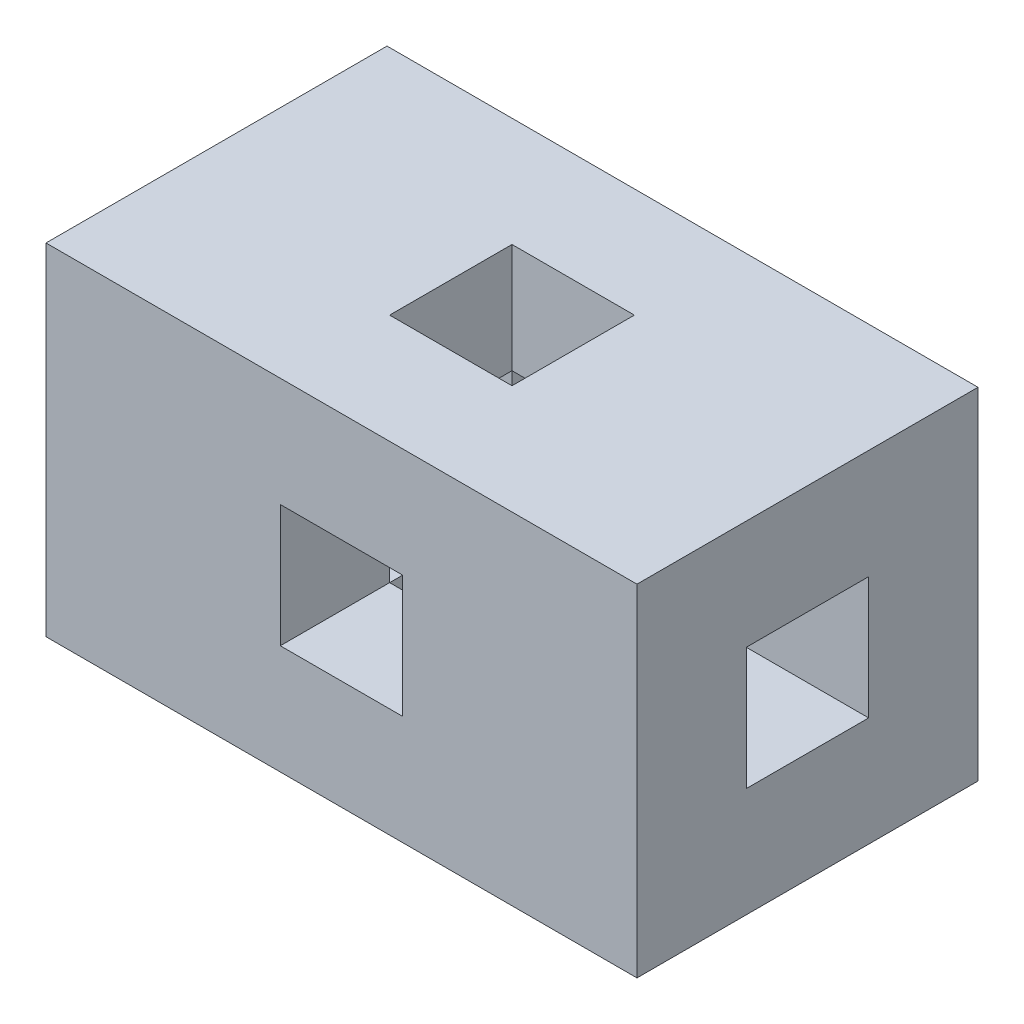
ISO-10303-21;
HEADER;
FILE_DESCRIPTION(('STEP AP214'),'2;1');
FILE_NAME('part.step','',(''),(''),'','','');
FILE_SCHEMA(('AUTOMOTIVE_DESIGN { 1 0 10303 214 1 1 1 1 }'));
ENDSEC;
DATA;
#1=APPLICATION_CONTEXT('core data for automotive mechanical design processes');
#2=APPLICATION_PROTOCOL_DEFINITION('international standard','automotive_design',2000,#1);
#3=PRODUCT_CONTEXT('',#1,'mechanical');
#4=PRODUCT('Part','Part','',(#3));
#5=PRODUCT_RELATED_PRODUCT_CATEGORY('part','',(#4));
#6=PRODUCT_DEFINITION_FORMATION('','',#4);
#7=PRODUCT_DEFINITION_CONTEXT('part definition',#1,'design');
#8=PRODUCT_DEFINITION('design','',#6,#7);
#9=PRODUCT_DEFINITION_SHAPE('','',#8);
#10=(LENGTH_UNIT() NAMED_UNIT(*) SI_UNIT(.MILLI.,.METRE.));
#11=(NAMED_UNIT(*) PLANE_ANGLE_UNIT() SI_UNIT($,.RADIAN.));
#12=(NAMED_UNIT(*) SI_UNIT($,.STERADIAN.) SOLID_ANGLE_UNIT());
#13=UNCERTAINTY_MEASURE_WITH_UNIT(LENGTH_MEASURE(1.E-05),#10,'distance_accuracy_value','');
#14=(GEOMETRIC_REPRESENTATION_CONTEXT(3) GLOBAL_UNCERTAINTY_ASSIGNED_CONTEXT((#13)) GLOBAL_UNIT_ASSIGNED_CONTEXT((#10,
#11,#12)) REPRESENTATION_CONTEXT('',''));
#15=CARTESIAN_POINT('',(0.,0.,0.));
#16=DIRECTION('',(0.,0.,1.));
#17=DIRECTION('',(1.,0.,0.));
#18=AXIS2_PLACEMENT_3D('',#15,#16,#17);
#19=CARTESIAN_POINT('',(7.747,-21.59,-7.747));
#20=DIRECTION('',(1.,0.,0.));
#21=DIRECTION('',(0.,0.,-1.));
#22=AXIS2_PLACEMENT_3D('',#19,#20,#21);
#23=PLANE('',#22);
#24=DIRECTION('',(0.,0.,1.));
#25=VECTOR('',#24,1.);
#26=CARTESIAN_POINT('',(7.747,-7.747,-21.59));
#27=LINE('',#26,#25);
#28=CARTESIAN_POINT('',(7.747,-7.747,-21.59));
#29=VERTEX_POINT('',#28);
#30=CARTESIAN_POINT('',(7.747,-7.747,-7.747));
#31=VERTEX_POINT('',#30);
#32=EDGE_CURVE('E262',#29,#31,#27,.T.);
#33=ORIENTED_EDGE('',*,*,#32,.T.);
#34=DIRECTION('',(0.,1.,0.));
#35=VECTOR('',#34,1.);
#36=CARTESIAN_POINT('',(7.747,-21.59,-7.74700000000001));
#37=LINE('',#36,#35);
#38=CARTESIAN_POINT('',(7.747,7.747,-7.747));
#39=VERTEX_POINT('',#38);
#40=EDGE_CURVE('E227',#31,#39,#37,.T.);
#41=ORIENTED_EDGE('',*,*,#40,.T.);
#42=DIRECTION('',(0.,0.,1.));
#43=VECTOR('',#42,1.);
#44=CARTESIAN_POINT('',(7.747,7.747,-21.59));
#45=LINE('',#44,#43);
#46=CARTESIAN_POINT('',(7.747,7.747,-21.59));
#47=VERTEX_POINT('',#46);
#48=EDGE_CURVE('E275',#47,#39,#45,.T.);
#49=ORIENTED_EDGE('',*,*,#48,.F.);
#50=DIRECTION('',(0.,1.,0.));
#51=VECTOR('',#50,1.);
#52=CARTESIAN_POINT('',(7.747,7.747,-21.59));
#53=LINE('',#52,#51);
#54=EDGE_CURVE('E239',#29,#47,#53,.T.);
#55=ORIENTED_EDGE('',*,*,#54,.F.);
#56=EDGE_LOOP('',(#33,#41,#49,#55));
#57=FACE_BOUND('',#56,.T.);
#58=ADVANCED_FACE('F35',(#57),#23,.F.);
#59=DIRECTION('',(0.,1.,0.));
#60=VECTOR('',#59,1.);
#61=CARTESIAN_POINT('',(7.747,-21.59,7.747));
#62=LINE('',#61,#60);
#63=CARTESIAN_POINT('',(7.747,-21.59,7.747));
#64=VERTEX_POINT('',#63);
#65=CARTESIAN_POINT('',(7.747,-7.747,7.747));
#66=VERTEX_POINT('',#65);
#67=EDGE_CURVE('E308',#64,#66,#62,.T.);
#68=ORIENTED_EDGE('',*,*,#67,.T.);
#69=DIRECTION('',(0.,0.,-1.));
#70=VECTOR('',#69,1.);
#71=CARTESIAN_POINT('',(7.747,-7.747,-7.747));
#72=LINE('',#71,#70);
#73=EDGE_CURVE('E235',#66,#31,#72,.T.);
#74=ORIENTED_EDGE('',*,*,#73,.T.);
#75=DIRECTION('',(0.,1.,0.));
#76=VECTOR('',#75,1.);
#77=CARTESIAN_POINT('',(7.747,-21.59,-7.747));
#78=LINE('',#77,#76);
#79=CARTESIAN_POINT('',(7.747,-21.59,-7.747));
#80=VERTEX_POINT('',#79);
#81=EDGE_CURVE('E321',#80,#31,#78,.T.);
#82=ORIENTED_EDGE('',*,*,#81,.F.);
#83=DIRECTION('',(0.,0.,-1.));
#84=VECTOR('',#83,1.);
#85=CARTESIAN_POINT('',(7.747,-21.59,-7.747));
#86=LINE('',#85,#84);
#87=EDGE_CURVE('E284',#64,#80,#86,.T.);
#88=ORIENTED_EDGE('',*,*,#87,.F.);
#89=EDGE_LOOP('',(#68,#74,#82,#88));
#90=FACE_BOUND('',#89,.T.);
#91=ADVANCED_FACE('F371',(#90),#23,.F.);
#92=CARTESIAN_POINT('',(7.747,7.747,7.747));
#93=VERTEX_POINT('',#92);
#94=CARTESIAN_POINT('',(7.747,7.747,21.59));
#95=VERTEX_POINT('',#94);
#96=EDGE_CURVE('E252',#93,#95,#45,.T.);
#97=ORIENTED_EDGE('',*,*,#96,.F.);
#98=DIRECTION('',(0.,-1.,0.));
#99=VECTOR('',#98,1.);
#100=CARTESIAN_POINT('',(7.747,-21.59,7.74699999999999));
#101=LINE('',#100,#99);
#102=EDGE_CURVE('E223',#93,#66,#101,.T.);
#103=ORIENTED_EDGE('',*,*,#102,.T.);
#104=CARTESIAN_POINT('',(7.747,-7.747,21.59));
#105=VERTEX_POINT('',#104);
#106=EDGE_CURVE('E266',#66,#105,#27,.T.);
#107=ORIENTED_EDGE('',*,*,#106,.T.);
#108=DIRECTION('',(0.,1.,0.));
#109=VECTOR('',#108,1.);
#110=CARTESIAN_POINT('',(7.747,7.747,21.59));
#111=LINE('',#110,#109);
#112=EDGE_CURVE('E238',#105,#95,#111,.T.);
#113=ORIENTED_EDGE('',*,*,#112,.T.);
#114=EDGE_LOOP('',(#97,#103,#107,#113));
#115=FACE_BOUND('',#114,.T.);
#116=ADVANCED_FACE('F384',(#115),#23,.F.);
#117=CARTESIAN_POINT('',(-7.747,-21.59,-7.747));
#118=DIRECTION('',(-1.,0.,0.));
#119=DIRECTION('',(0.,0.,1.));
#120=AXIS2_PLACEMENT_3D('',#117,#118,#119);
#121=PLANE('',#120);
#122=DIRECTION('',(0.,0.,1.));
#123=VECTOR('',#122,1.);
#124=CARTESIAN_POINT('',(-7.747,7.747,-21.59));
#125=LINE('',#124,#123);
#126=CARTESIAN_POINT('',(-7.747,7.747,-21.59));
#127=VERTEX_POINT('',#126);
#128=CARTESIAN_POINT('',(-7.747,7.747,-7.747));
#129=VERTEX_POINT('',#128);
#130=EDGE_CURVE('E271',#127,#129,#125,.T.);
#131=ORIENTED_EDGE('',*,*,#130,.T.);
#132=DIRECTION('',(0.,-1.,0.));
#133=VECTOR('',#132,1.);
#134=CARTESIAN_POINT('',(-7.747,-21.59,-7.74700000000001));
#135=LINE('',#134,#133);
#136=CARTESIAN_POINT('',(-7.747,-7.747,-7.747));
#137=VERTEX_POINT('',#136);
#138=EDGE_CURVE('E182',#129,#137,#135,.T.);
#139=ORIENTED_EDGE('',*,*,#138,.T.);
#140=DIRECTION('',(0.,0.,1.));
#141=VECTOR('',#140,1.);
#142=CARTESIAN_POINT('',(-7.747,-7.747,-21.59));
#143=LINE('',#142,#141);
#144=CARTESIAN_POINT('',(-7.747,-7.747,-21.59));
#145=VERTEX_POINT('',#144);
#146=EDGE_CURVE('E267',#145,#137,#143,.T.);
#147=ORIENTED_EDGE('',*,*,#146,.F.);
#148=DIRECTION('',(0.,-1.,0.));
#149=VECTOR('',#148,1.);
#150=CARTESIAN_POINT('',(-7.747,7.747,-21.59));
#151=LINE('',#150,#149);
#152=EDGE_CURVE('E246',#127,#145,#151,.T.);
#153=ORIENTED_EDGE('',*,*,#152,.F.);
#154=EDGE_LOOP('',(#131,#139,#147,#153));
#155=FACE_BOUND('',#154,.T.);
#156=ADVANCED_FACE('F427',(#155),#121,.F.);
#157=DIRECTION('',(0.,1.,0.));
#158=VECTOR('',#157,1.);
#159=CARTESIAN_POINT('',(-7.747,-21.59,-7.747));
#160=LINE('',#159,#158);
#161=CARTESIAN_POINT('',(-7.747,-21.59,-7.747));
#162=VERTEX_POINT('',#161);
#163=EDGE_CURVE('E317',#162,#137,#160,.T.);
#164=ORIENTED_EDGE('',*,*,#163,.T.);
#165=DIRECTION('',(0.,0.,1.));
#166=VECTOR('',#165,1.);
#167=CARTESIAN_POINT('',(-7.747,-7.747,-7.747));
#168=LINE('',#167,#166);
#169=CARTESIAN_POINT('',(-7.747,-7.747,7.747));
#170=VERTEX_POINT('',#169);
#171=EDGE_CURVE('E11',#137,#170,#168,.T.);
#172=ORIENTED_EDGE('',*,*,#171,.T.);
#173=DIRECTION('',(0.,1.,0.));
#174=VECTOR('',#173,1.);
#175=CARTESIAN_POINT('',(-7.747,-21.59,7.747));
#176=LINE('',#175,#174);
#177=CARTESIAN_POINT('',(-7.747,-21.59,7.747));
#178=VERTEX_POINT('',#177);
#179=EDGE_CURVE('E313',#178,#170,#176,.T.);
#180=ORIENTED_EDGE('',*,*,#179,.F.);
#181=DIRECTION('',(0.,0.,1.));
#182=VECTOR('',#181,1.);
#183=CARTESIAN_POINT('',(-7.747,-21.59,-7.747));
#184=LINE('',#183,#182);
#185=EDGE_CURVE('E291',#162,#178,#184,.T.);
#186=ORIENTED_EDGE('',*,*,#185,.F.);
#187=EDGE_LOOP('',(#164,#172,#180,#186));
#188=FACE_BOUND('',#187,.T.);
#189=ADVANCED_FACE('F363',(#188),#121,.F.);
#190=CARTESIAN_POINT('',(-7.747,-7.747,21.59));
#191=VERTEX_POINT('',#190);
#192=EDGE_CURVE('E270',#170,#191,#143,.T.);
#193=ORIENTED_EDGE('',*,*,#192,.F.);
#194=DIRECTION('',(0.,1.,0.));
#195=VECTOR('',#194,1.);
#196=CARTESIAN_POINT('',(-7.747,-21.59,7.74699999999999));
#197=LINE('',#196,#195);
#198=CARTESIAN_POINT('',(-7.747,7.747,7.747));
#199=VERTEX_POINT('',#198);
#200=EDGE_CURVE('E214',#170,#199,#197,.T.);
#201=ORIENTED_EDGE('',*,*,#200,.T.);
#202=CARTESIAN_POINT('',(-7.747,7.747,21.59));
#203=VERTEX_POINT('',#202);
#204=EDGE_CURVE('E274',#199,#203,#125,.T.);
#205=ORIENTED_EDGE('',*,*,#204,.T.);
#206=DIRECTION('',(0.,-1.,0.));
#207=VECTOR('',#206,1.);
#208=CARTESIAN_POINT('',(-7.747,7.747,21.59));
#209=LINE('',#208,#207);
#210=EDGE_CURVE('E257',#203,#191,#209,.T.);
#211=ORIENTED_EDGE('',*,*,#210,.T.);
#212=EDGE_LOOP('',(#193,#201,#205,#211));
#213=FACE_BOUND('',#212,.T.);
#214=ADVANCED_FACE('F395',(#213),#121,.F.);
#215=CARTESIAN_POINT('',(-7.747,-21.59,7.747));
#216=DIRECTION('',(0.,0.,1.));
#217=DIRECTION('',(1.,0.,0.));
#218=AXIS2_PLACEMENT_3D('',#215,#216,#217);
#219=PLANE('',#218);
#220=ORIENTED_EDGE('',*,*,#179,.T.);
#221=DIRECTION('',(1.,0.,0.));
#222=VECTOR('',#221,1.);
#223=CARTESIAN_POINT('',(-7.747,-7.747,7.747));
#224=LINE('',#223,#222);
#225=EDGE_CURVE('E280',#170,#66,#224,.T.);
#226=ORIENTED_EDGE('',*,*,#225,.T.);
#227=ORIENTED_EDGE('',*,*,#67,.F.);
#228=DIRECTION('',(1.,0.,0.));
#229=VECTOR('',#228,1.);
#230=CARTESIAN_POINT('',(-7.747,-21.59,7.747));
#231=LINE('',#230,#229);
#232=EDGE_CURVE('E294',#178,#64,#231,.T.);
#233=ORIENTED_EDGE('',*,*,#232,.F.);
#234=EDGE_LOOP('',(#220,#226,#227,#233));
#235=FACE_BOUND('',#234,.T.);
#236=ADVANCED_FACE('F393',(#235),#219,.F.);
#237=CARTESIAN_POINT('',(-7.747,-21.59,-7.747));
#238=DIRECTION('',(0.,0.,-1.));
#239=DIRECTION('',(-1.,0.,0.));
#240=AXIS2_PLACEMENT_3D('',#237,#238,#239);
#241=PLANE('',#240);
#242=ORIENTED_EDGE('',*,*,#81,.T.);
#243=DIRECTION('',(-1.,0.,0.));
#244=VECTOR('',#243,1.);
#245=CARTESIAN_POINT('',(-7.747,-7.747,-7.747));
#246=LINE('',#245,#244);
#247=EDGE_CURVE('E43',#31,#137,#246,.T.);
#248=ORIENTED_EDGE('',*,*,#247,.T.);
#249=ORIENTED_EDGE('',*,*,#163,.F.);
#250=DIRECTION('',(-1.,0.,0.));
#251=VECTOR('',#250,1.);
#252=CARTESIAN_POINT('',(-7.747,-21.59,-7.747));
#253=LINE('',#252,#251);
#254=EDGE_CURVE('E287',#80,#162,#253,.T.);
#255=ORIENTED_EDGE('',*,*,#254,.F.);
#256=EDGE_LOOP('',(#242,#248,#249,#255));
#257=FACE_BOUND('',#256,.T.);
#258=ADVANCED_FACE('F359',(#257),#241,.F.);
#259=CARTESIAN_POINT('',(37.4142,21.59,21.59));
#260=DIRECTION('',(-1.,0.,0.));
#261=DIRECTION('',(0.,0.,1.));
#262=AXIS2_PLACEMENT_3D('',#259,#260,#261);
#263=PLANE('',#262);
#264=DIRECTION('',(0.,0.,1.));
#265=VECTOR('',#264,1.);
#266=CARTESIAN_POINT('',(37.4142,7.747,7.747));
#267=LINE('',#266,#265);
#268=CARTESIAN_POINT('',(37.4142,7.747,-7.747));
#269=VERTEX_POINT('',#268);
#270=CARTESIAN_POINT('',(37.4142,7.747,7.747));
#271=VERTEX_POINT('',#270);
#272=EDGE_CURVE('E207',#269,#271,#267,.T.);
#273=ORIENTED_EDGE('',*,*,#272,.F.);
#274=DIRECTION('',(0.,1.,0.));
#275=VECTOR('',#274,1.);
#276=CARTESIAN_POINT('',(37.4142,7.747,-7.747));
#277=LINE('',#276,#275);
#278=CARTESIAN_POINT('',(37.4142,-7.747,-7.747));
#279=VERTEX_POINT('',#278);
#280=EDGE_CURVE('E50',#279,#269,#277,.T.);
#281=ORIENTED_EDGE('',*,*,#280,.F.);
#282=DIRECTION('',(0.,0.,-1.));
#283=VECTOR('',#282,1.);
#284=CARTESIAN_POINT('',(37.4142,-7.747,7.747));
#285=LINE('',#284,#283);
#286=CARTESIAN_POINT('',(37.4142,-7.747,7.747));
#287=VERTEX_POINT('',#286);
#288=EDGE_CURVE('E198',#287,#279,#285,.T.);
#289=ORIENTED_EDGE('',*,*,#288,.F.);
#290=DIRECTION('',(0.,-1.,0.));
#291=VECTOR('',#290,1.);
#292=CARTESIAN_POINT('',(37.4142,7.747,7.747));
#293=LINE('',#292,#291);
#294=EDGE_CURVE('E201',#271,#287,#293,.T.);
#295=ORIENTED_EDGE('',*,*,#294,.F.);
#296=EDGE_LOOP('',(#273,#281,#289,#295));
#297=FACE_BOUND('',#296,.T.);
#298=DIRECTION('',(0.,0.,-1.));
#299=VECTOR('',#298,1.);
#300=CARTESIAN_POINT('',(37.4142,-21.59,21.59));
#301=LINE('',#300,#299);
#302=CARTESIAN_POINT('',(37.4142,-21.59,21.59));
#303=VERTEX_POINT('',#302);
#304=CARTESIAN_POINT('',(37.4142,-21.59,-21.59));
#305=VERTEX_POINT('',#304);
#306=EDGE_CURVE('E311',#303,#305,#301,.T.);
#307=ORIENTED_EDGE('',*,*,#306,.T.);
#308=DIRECTION('',(0.,-1.,0.));
#309=VECTOR('',#308,1.);
#310=CARTESIAN_POINT('',(37.4142,21.59,-21.59));
#311=LINE('',#310,#309);
#312=CARTESIAN_POINT('',(37.4142,21.59,-21.59));
#313=VERTEX_POINT('',#312);
#314=EDGE_CURVE('E350',#313,#305,#311,.T.);
#315=ORIENTED_EDGE('',*,*,#314,.F.);
#316=DIRECTION('',(0.,0.,-1.));
#317=VECTOR('',#316,1.);
#318=CARTESIAN_POINT('',(37.4142,21.59,21.59));
#319=LINE('',#318,#317);
#320=CARTESIAN_POINT('',(37.4142,21.59,21.59));
#321=VERTEX_POINT('',#320);
#322=EDGE_CURVE('E324',#321,#313,#319,.T.);
#323=ORIENTED_EDGE('',*,*,#322,.F.);
#324=DIRECTION('',(0.,-1.,0.));
#325=VECTOR('',#324,1.);
#326=CARTESIAN_POINT('',(37.4142,21.59,21.59));
#327=LINE('',#326,#325);
#328=EDGE_CURVE('E334',#321,#303,#327,.T.);
#329=ORIENTED_EDGE('',*,*,#328,.T.);
#330=EDGE_LOOP('',(#307,#315,#323,#329));
#331=FACE_BOUND('',#330,.T.);
#332=ADVANCED_FACE('F37',(#297,#331),#263,.F.);
#333=CARTESIAN_POINT('',(37.4142,21.59,-21.59));
#334=DIRECTION('',(0.,0.,1.));
#335=DIRECTION('',(1.,0.,0.));
#336=AXIS2_PLACEMENT_3D('',#333,#334,#335);
#337=PLANE('',#336);
#338=DIRECTION('',(1.,0.,0.));
#339=VECTOR('',#338,1.);
#340=CARTESIAN_POINT('',(-7.747,-7.747,-21.59));
#341=LINE('',#340,#339);
#342=EDGE_CURVE('E249',#145,#29,#341,.T.);
#343=ORIENTED_EDGE('',*,*,#342,.T.);
#344=ORIENTED_EDGE('',*,*,#54,.T.);
#345=DIRECTION('',(-1.,0.,0.));
#346=VECTOR('',#345,1.);
#347=CARTESIAN_POINT('',(-7.747,7.747,-21.59));
#348=LINE('',#347,#346);
#349=EDGE_CURVE('E242',#47,#127,#348,.T.);
#350=ORIENTED_EDGE('',*,*,#349,.T.);
#351=ORIENTED_EDGE('',*,*,#152,.T.);
#352=EDGE_LOOP('',(#343,#344,#350,#351));
#353=FACE_BOUND('',#352,.T.);
#354=DIRECTION('',(-1.,0.,0.));
#355=VECTOR('',#354,1.);
#356=CARTESIAN_POINT('',(37.4142,-21.59,-21.59));
#357=LINE('',#356,#355);
#358=CARTESIAN_POINT('',(-37.4142,-21.59,-21.59));
#359=VERTEX_POINT('',#358);
#360=EDGE_CURVE('E337',#305,#359,#357,.T.);
#361=ORIENTED_EDGE('',*,*,#360,.T.);
#362=DIRECTION('',(0.,-1.,0.));
#363=VECTOR('',#362,1.);
#364=CARTESIAN_POINT('',(-37.4142,21.59,-21.59));
#365=LINE('',#364,#363);
#366=CARTESIAN_POINT('',(-37.4142,21.59,-21.59));
#367=VERTEX_POINT('',#366);
#368=EDGE_CURVE('E347',#367,#359,#365,.T.);
#369=ORIENTED_EDGE('',*,*,#368,.F.);
#370=DIRECTION('',(-1.,0.,0.));
#371=VECTOR('',#370,1.);
#372=CARTESIAN_POINT('',(37.4142,21.59,-21.59));
#373=LINE('',#372,#371);
#374=EDGE_CURVE('E327',#313,#367,#373,.T.);
#375=ORIENTED_EDGE('',*,*,#374,.F.);
#376=ORIENTED_EDGE('',*,*,#314,.T.);
#377=EDGE_LOOP('',(#361,#369,#375,#376));
#378=FACE_BOUND('',#377,.T.);
#379=ADVANCED_FACE('F462',(#353,#378),#337,.F.);
#380=CARTESIAN_POINT('',(-37.4142,21.59,21.59));
#381=DIRECTION('',(1.,0.,0.));
#382=DIRECTION('',(0.,0.,-1.));
#383=AXIS2_PLACEMENT_3D('',#380,#381,#382);
#384=PLANE('',#383);
#385=DIRECTION('',(0.,0.,-1.));
#386=VECTOR('',#385,1.);
#387=CARTESIAN_POINT('',(-37.4142,-7.747,7.747));
#388=LINE('',#387,#386);
#389=CARTESIAN_POINT('',(-37.4142,-7.747,7.747));
#390=VERTEX_POINT('',#389);
#391=CARTESIAN_POINT('',(-37.4142,-7.747,-7.747));
#392=VERTEX_POINT('',#391);
#393=EDGE_CURVE('E197',#390,#392,#388,.T.);
#394=ORIENTED_EDGE('',*,*,#393,.T.);
#395=DIRECTION('',(0.,1.,0.));
#396=VECTOR('',#395,1.);
#397=CARTESIAN_POINT('',(-37.4142,7.747,-7.747));
#398=LINE('',#397,#396);
#399=CARTESIAN_POINT('',(-37.4142,7.747,-7.747));
#400=VERTEX_POINT('',#399);
#401=EDGE_CURVE('E179',#392,#400,#398,.T.);
#402=ORIENTED_EDGE('',*,*,#401,.T.);
#403=DIRECTION('',(0.,0.,1.));
#404=VECTOR('',#403,1.);
#405=CARTESIAN_POINT('',(-37.4142,7.747,7.747));
#406=LINE('',#405,#404);
#407=CARTESIAN_POINT('',(-37.4142,7.747,7.747));
#408=VERTEX_POINT('',#407);
#409=EDGE_CURVE('E189',#400,#408,#406,.T.);
#410=ORIENTED_EDGE('',*,*,#409,.T.);
#411=DIRECTION('',(0.,-1.,0.));
#412=VECTOR('',#411,1.);
#413=CARTESIAN_POINT('',(-37.4142,7.747,7.747));
#414=LINE('',#413,#412);
#415=EDGE_CURVE('E58',#408,#390,#414,.T.);
#416=ORIENTED_EDGE('',*,*,#415,.T.);
#417=EDGE_LOOP('',(#394,#402,#410,#416));
#418=FACE_BOUND('',#417,.T.);
#419=DIRECTION('',(0.,0.,1.));
#420=VECTOR('',#419,1.);
#421=CARTESIAN_POINT('',(-37.4142,-21.59,21.59));
#422=LINE('',#421,#420);
#423=CARTESIAN_POINT('',(-37.4142,-21.59,21.59));
#424=VERTEX_POINT('',#423);
#425=EDGE_CURVE('E339',#359,#424,#422,.T.);
#426=ORIENTED_EDGE('',*,*,#425,.T.);
#427=DIRECTION('',(0.,-1.,0.));
#428=VECTOR('',#427,1.);
#429=CARTESIAN_POINT('',(-37.4142,21.59,21.59));
#430=LINE('',#429,#428);
#431=CARTESIAN_POINT('',(-37.4142,21.59,21.59));
#432=VERTEX_POINT('',#431);
#433=EDGE_CURVE('E344',#432,#424,#430,.T.);
#434=ORIENTED_EDGE('',*,*,#433,.F.);
#435=DIRECTION('',(0.,0.,1.));
#436=VECTOR('',#435,1.);
#437=CARTESIAN_POINT('',(-37.4142,21.59,21.59));
#438=LINE('',#437,#436);
#439=EDGE_CURVE('E330',#367,#432,#438,.T.);
#440=ORIENTED_EDGE('',*,*,#439,.F.);
#441=ORIENTED_EDGE('',*,*,#368,.T.);
#442=EDGE_LOOP('',(#426,#434,#440,#441));
#443=FACE_BOUND('',#442,.T.);
#444=ADVANCED_FACE('F194',(#418,#443),#384,.F.);
#445=CARTESIAN_POINT('',(37.4142,21.59,21.59));
#446=DIRECTION('',(0.,0.,-1.));
#447=DIRECTION('',(-1.,0.,0.));
#448=AXIS2_PLACEMENT_3D('',#445,#446,#447);
#449=PLANE('',#448);
#450=DIRECTION('',(-1.,0.,0.));
#451=VECTOR('',#450,1.);
#452=CARTESIAN_POINT('',(-7.747,7.747,21.59));
#453=LINE('',#452,#451);
#454=EDGE_CURVE('E254',#95,#203,#453,.T.);
#455=ORIENTED_EDGE('',*,*,#454,.F.);
#456=ORIENTED_EDGE('',*,*,#112,.F.);
#457=DIRECTION('',(1.,0.,0.));
#458=VECTOR('',#457,1.);
#459=CARTESIAN_POINT('',(-7.747,-7.747,21.59));
#460=LINE('',#459,#458);
#461=EDGE_CURVE('E243',#191,#105,#460,.T.);
#462=ORIENTED_EDGE('',*,*,#461,.F.);
#463=ORIENTED_EDGE('',*,*,#210,.F.);
#464=EDGE_LOOP('',(#455,#456,#462,#463));
#465=FACE_BOUND('',#464,.T.);
#466=DIRECTION('',(1.,0.,0.));
#467=VECTOR('',#466,1.);
#468=CARTESIAN_POINT('',(37.4142,-21.59,21.59));
#469=LINE('',#468,#467);
#470=EDGE_CURVE('E328',#424,#303,#469,.T.);
#471=ORIENTED_EDGE('',*,*,#470,.T.);
#472=ORIENTED_EDGE('',*,*,#328,.F.);
#473=DIRECTION('',(1.,0.,0.));
#474=VECTOR('',#473,1.);
#475=CARTESIAN_POINT('',(37.4142,21.59,21.59));
#476=LINE('',#475,#474);
#477=EDGE_CURVE('E332',#432,#321,#476,.T.);
#478=ORIENTED_EDGE('',*,*,#477,.F.);
#479=ORIENTED_EDGE('',*,*,#433,.T.);
#480=EDGE_LOOP('',(#471,#472,#478,#479));
#481=FACE_BOUND('',#480,.T.);
#482=ADVANCED_FACE('F470',(#465,#481),#449,.F.);
#483=CARTESIAN_POINT('',(0.,21.59,0.));
#484=DIRECTION('',(0.,1.,0.));
#485=DIRECTION('',(0.,0.,1.));
#486=AXIS2_PLACEMENT_3D('',#483,#484,#485);
#487=PLANE('',#486);
#488=DIRECTION('',(0.,0.,-1.));
#489=VECTOR('',#488,1.);
#490=CARTESIAN_POINT('',(7.747,21.59,-7.747));
#491=LINE('',#490,#489);
#492=CARTESIAN_POINT('',(7.747,21.59,7.747));
#493=VERTEX_POINT('',#492);
#494=CARTESIAN_POINT('',(7.747,21.59,-7.747));
#495=VERTEX_POINT('',#494);
#496=EDGE_CURVE('E283',#493,#495,#491,.T.);
#497=ORIENTED_EDGE('',*,*,#496,.F.);
#498=DIRECTION('',(1.,0.,0.));
#499=VECTOR('',#498,1.);
#500=CARTESIAN_POINT('',(-7.747,21.59,7.747));
#501=LINE('',#500,#499);
#502=CARTESIAN_POINT('',(-7.747,21.59,7.747));
#503=VERTEX_POINT('',#502);
#504=EDGE_CURVE('E288',#503,#493,#501,.T.);
#505=ORIENTED_EDGE('',*,*,#504,.F.);
#506=DIRECTION('',(0.,0.,1.));
#507=VECTOR('',#506,1.);
#508=CARTESIAN_POINT('',(-7.747,21.59,-7.747));
#509=LINE('',#508,#507);
#510=CARTESIAN_POINT('',(-7.747,21.59,-7.747));
#511=VERTEX_POINT('',#510);
#512=EDGE_CURVE('E303',#511,#503,#509,.T.);
#513=ORIENTED_EDGE('',*,*,#512,.F.);
#514=DIRECTION('',(-1.,0.,0.));
#515=VECTOR('',#514,1.);
#516=CARTESIAN_POINT('',(-7.747,21.59,-7.747));
#517=LINE('',#516,#515);
#518=EDGE_CURVE('E300',#495,#511,#517,.T.);
#519=ORIENTED_EDGE('',*,*,#518,.F.);
#520=EDGE_LOOP('',(#497,#505,#513,#519));
#521=FACE_BOUND('',#520,.T.);
#522=ORIENTED_EDGE('',*,*,#322,.T.);
#523=ORIENTED_EDGE('',*,*,#374,.T.);
#524=ORIENTED_EDGE('',*,*,#439,.T.);
#525=ORIENTED_EDGE('',*,*,#477,.T.);
#526=EDGE_LOOP('',(#522,#523,#524,#525));
#527=FACE_BOUND('',#526,.T.);
#528=ADVANCED_FACE('F423',(#521,#527),#487,.T.);
#529=CARTESIAN_POINT('',(0.,-21.59,0.));
#530=DIRECTION('',(0.,1.,0.));
#531=DIRECTION('',(0.,0.,1.));
#532=AXIS2_PLACEMENT_3D('',#529,#530,#531);
#533=PLANE('',#532);
#534=ORIENTED_EDGE('',*,*,#232,.T.);
#535=ORIENTED_EDGE('',*,*,#87,.T.);
#536=ORIENTED_EDGE('',*,*,#254,.T.);
#537=ORIENTED_EDGE('',*,*,#185,.T.);
#538=EDGE_LOOP('',(#534,#535,#536,#537));
#539=FACE_BOUND('',#538,.T.);
#540=ORIENTED_EDGE('',*,*,#306,.F.);
#541=ORIENTED_EDGE('',*,*,#470,.F.);
#542=ORIENTED_EDGE('',*,*,#425,.F.);
#543=ORIENTED_EDGE('',*,*,#360,.F.);
#544=EDGE_LOOP('',(#540,#541,#542,#543));
#545=FACE_BOUND('',#544,.T.);
#546=ADVANCED_FACE('F367',(#539,#545),#533,.F.);
#547=EDGE_CURVE('E297',#39,#495,#78,.T.);
#548=ORIENTED_EDGE('',*,*,#547,.F.);
#549=DIRECTION('',(0.,0.,1.));
#550=VECTOR('',#549,1.);
#551=CARTESIAN_POINT('',(7.747,7.747,-7.747));
#552=LINE('',#551,#550);
#553=EDGE_CURVE('E232',#39,#93,#552,.T.);
#554=ORIENTED_EDGE('',*,*,#553,.T.);
#555=EDGE_CURVE('E312',#93,#493,#62,.T.);
#556=ORIENTED_EDGE('',*,*,#555,.T.);
#557=ORIENTED_EDGE('',*,*,#496,.T.);
#558=EDGE_LOOP('',(#548,#554,#556,#557));
#559=FACE_BOUND('',#558,.T.);
#560=ADVANCED_FACE('F409',(#559),#23,.F.);
#561=ORIENTED_EDGE('',*,*,#555,.F.);
#562=DIRECTION('',(-1.,0.,0.));
#563=VECTOR('',#562,1.);
#564=CARTESIAN_POINT('',(-7.747,7.747,7.747));
#565=LINE('',#564,#563);
#566=EDGE_CURVE('E265',#93,#199,#565,.T.);
#567=ORIENTED_EDGE('',*,*,#566,.T.);
#568=EDGE_CURVE('E316',#199,#503,#176,.T.);
#569=ORIENTED_EDGE('',*,*,#568,.T.);
#570=ORIENTED_EDGE('',*,*,#504,.T.);
#571=EDGE_LOOP('',(#561,#567,#569,#570));
#572=FACE_BOUND('',#571,.T.);
#573=ADVANCED_FACE('F397',(#572),#219,.F.);
#574=ORIENTED_EDGE('',*,*,#568,.F.);
#575=DIRECTION('',(0.,0.,-1.));
#576=VECTOR('',#575,1.);
#577=CARTESIAN_POINT('',(-7.747,7.747,-7.747));
#578=LINE('',#577,#576);
#579=EDGE_CURVE('E230',#199,#129,#578,.T.);
#580=ORIENTED_EDGE('',*,*,#579,.T.);
#581=EDGE_CURVE('E320',#129,#511,#160,.T.);
#582=ORIENTED_EDGE('',*,*,#581,.T.);
#583=ORIENTED_EDGE('',*,*,#512,.T.);
#584=EDGE_LOOP('',(#574,#580,#582,#583));
#585=FACE_BOUND('',#584,.T.);
#586=ADVANCED_FACE('F406',(#585),#121,.F.);
#587=ORIENTED_EDGE('',*,*,#581,.F.);
#588=DIRECTION('',(1.,0.,0.));
#589=VECTOR('',#588,1.);
#590=CARTESIAN_POINT('',(-7.747,7.747,-7.747));
#591=LINE('',#590,#589);
#592=EDGE_CURVE('E353',#129,#39,#591,.T.);
#593=ORIENTED_EDGE('',*,*,#592,.T.);
#594=ORIENTED_EDGE('',*,*,#547,.T.);
#595=ORIENTED_EDGE('',*,*,#518,.T.);
#596=EDGE_LOOP('',(#587,#593,#594,#595));
#597=FACE_BOUND('',#596,.T.);
#598=ADVANCED_FACE('F403',(#597),#241,.F.);
#599=CARTESIAN_POINT('',(-7.747,7.747,-21.59));
#600=DIRECTION('',(0.,1.,0.));
#601=DIRECTION('',(0.,0.,1.));
#602=AXIS2_PLACEMENT_3D('',#599,#600,#601);
#603=PLANE('',#602);
#604=ORIENTED_EDGE('',*,*,#130,.F.);
#605=ORIENTED_EDGE('',*,*,#349,.F.);
#606=ORIENTED_EDGE('',*,*,#48,.T.);
#607=ORIENTED_EDGE('',*,*,#592,.F.);
#608=EDGE_LOOP('',(#604,#605,#606,#607));
#609=FACE_BOUND('',#608,.T.);
#610=ADVANCED_FACE('F440',(#609),#603,.F.);
#611=CARTESIAN_POINT('',(-7.747,-7.747,-21.59));
#612=DIRECTION('',(0.,-1.,0.));
#613=DIRECTION('',(0.,0.,-1.));
#614=AXIS2_PLACEMENT_3D('',#611,#612,#613);
#615=PLANE('',#614);
#616=ORIENTED_EDGE('',*,*,#32,.F.);
#617=ORIENTED_EDGE('',*,*,#342,.F.);
#618=ORIENTED_EDGE('',*,*,#146,.T.);
#619=ORIENTED_EDGE('',*,*,#247,.F.);
#620=EDGE_LOOP('',(#616,#617,#618,#619));
#621=FACE_BOUND('',#620,.T.);
#622=ADVANCED_FACE('F459',(#621),#615,.F.);
#623=ORIENTED_EDGE('',*,*,#192,.T.);
#624=ORIENTED_EDGE('',*,*,#461,.T.);
#625=ORIENTED_EDGE('',*,*,#106,.F.);
#626=ORIENTED_EDGE('',*,*,#225,.F.);
#627=EDGE_LOOP('',(#623,#624,#625,#626));
#628=FACE_BOUND('',#627,.T.);
#629=ADVANCED_FACE('F388',(#628),#615,.F.);
#630=ORIENTED_EDGE('',*,*,#96,.T.);
#631=ORIENTED_EDGE('',*,*,#454,.T.);
#632=ORIENTED_EDGE('',*,*,#204,.F.);
#633=ORIENTED_EDGE('',*,*,#566,.F.);
#634=EDGE_LOOP('',(#630,#631,#632,#633));
#635=FACE_BOUND('',#634,.T.);
#636=ADVANCED_FACE('F450',(#635),#603,.F.);
#637=CARTESIAN_POINT('',(-37.4142,7.747,7.747));
#638=DIRECTION('',(0.,1.,0.));
#639=DIRECTION('',(0.,0.,1.));
#640=AXIS2_PLACEMENT_3D('',#637,#638,#639);
#641=PLANE('',#640);
#642=DIRECTION('',(1.,0.,0.));
#643=VECTOR('',#642,1.);
#644=CARTESIAN_POINT('',(-37.4142,7.747,7.747));
#645=LINE('',#644,#643);
#646=EDGE_CURVE('E191',#408,#199,#645,.T.);
#647=ORIENTED_EDGE('',*,*,#646,.F.);
#648=ORIENTED_EDGE('',*,*,#409,.F.);
#649=DIRECTION('',(1.,0.,0.));
#650=VECTOR('',#649,1.);
#651=CARTESIAN_POINT('',(-37.4142,7.747,-7.747));
#652=LINE('',#651,#650);
#653=EDGE_CURVE('E174',#400,#129,#652,.T.);
#654=ORIENTED_EDGE('',*,*,#653,.T.);
#655=ORIENTED_EDGE('',*,*,#579,.F.);
#656=EDGE_LOOP('',(#647,#648,#654,#655));
#657=FACE_BOUND('',#656,.T.);
#658=ADVANCED_FACE('F190',(#657),#641,.F.);
#659=CARTESIAN_POINT('',(-37.4142,7.747,7.747));
#660=DIRECTION('',(0.,0.,1.));
#661=DIRECTION('',(0.,-1.,0.));
#662=AXIS2_PLACEMENT_3D('',#659,#660,#661);
#663=PLANE('',#662);
#664=DIRECTION('',(1.,0.,0.));
#665=VECTOR('',#664,1.);
#666=CARTESIAN_POINT('',(-37.4142,-7.747,7.747));
#667=LINE('',#666,#665);
#668=EDGE_CURVE('E216',#390,#170,#667,.T.);
#669=ORIENTED_EDGE('',*,*,#668,.F.);
#670=ORIENTED_EDGE('',*,*,#415,.F.);
#671=ORIENTED_EDGE('',*,*,#646,.T.);
#672=ORIENTED_EDGE('',*,*,#200,.F.);
#673=EDGE_LOOP('',(#669,#670,#671,#672));
#674=FACE_BOUND('',#673,.T.);
#675=ADVANCED_FACE('F453',(#674),#663,.F.);
#676=CARTESIAN_POINT('',(-37.4142,-7.747,7.747));
#677=DIRECTION('',(0.,-1.,0.));
#678=DIRECTION('',(0.,0.,-1.));
#679=AXIS2_PLACEMENT_3D('',#676,#677,#678);
#680=PLANE('',#679);
#681=DIRECTION('',(1.,0.,0.));
#682=VECTOR('',#681,1.);
#683=CARTESIAN_POINT('',(-37.4142,-7.747,-7.747));
#684=LINE('',#683,#682);
#685=EDGE_CURVE('E212',#392,#137,#684,.T.);
#686=ORIENTED_EDGE('',*,*,#685,.F.);
#687=ORIENTED_EDGE('',*,*,#393,.F.);
#688=ORIENTED_EDGE('',*,*,#668,.T.);
#689=ORIENTED_EDGE('',*,*,#171,.F.);
#690=EDGE_LOOP('',(#686,#687,#688,#689));
#691=FACE_BOUND('',#690,.T.);
#692=ADVANCED_FACE('F455',(#691),#680,.F.);
#693=CARTESIAN_POINT('',(-37.4142,7.747,-7.747));
#694=DIRECTION('',(0.,0.,-1.));
#695=DIRECTION('',(0.,1.,0.));
#696=AXIS2_PLACEMENT_3D('',#693,#694,#695);
#697=PLANE('',#696);
#698=ORIENTED_EDGE('',*,*,#653,.F.);
#699=ORIENTED_EDGE('',*,*,#401,.F.);
#700=ORIENTED_EDGE('',*,*,#685,.T.);
#701=ORIENTED_EDGE('',*,*,#138,.F.);
#702=EDGE_LOOP('',(#698,#699,#700,#701));
#703=FACE_BOUND('',#702,.T.);
#704=ADVANCED_FACE('F176',(#703),#697,.F.);
#705=EDGE_CURVE('E219',#66,#287,#667,.T.);
#706=ORIENTED_EDGE('',*,*,#705,.T.);
#707=ORIENTED_EDGE('',*,*,#288,.T.);
#708=EDGE_CURVE('E215',#31,#279,#684,.T.);
#709=ORIENTED_EDGE('',*,*,#708,.F.);
#710=ORIENTED_EDGE('',*,*,#73,.F.);
#711=EDGE_LOOP('',(#706,#707,#709,#710));
#712=FACE_BOUND('',#711,.T.);
#713=ADVANCED_FACE('F375',(#712),#680,.F.);
#714=EDGE_CURVE('E186',#39,#269,#652,.T.);
#715=ORIENTED_EDGE('',*,*,#714,.T.);
#716=ORIENTED_EDGE('',*,*,#272,.T.);
#717=EDGE_CURVE('E185',#93,#271,#645,.T.);
#718=ORIENTED_EDGE('',*,*,#717,.F.);
#719=ORIENTED_EDGE('',*,*,#553,.F.);
#720=EDGE_LOOP('',(#715,#716,#718,#719));
#721=FACE_BOUND('',#720,.T.);
#722=ADVANCED_FACE('F499',(#721),#641,.F.);
#723=ORIENTED_EDGE('',*,*,#708,.T.);
#724=ORIENTED_EDGE('',*,*,#280,.T.);
#725=ORIENTED_EDGE('',*,*,#714,.F.);
#726=ORIENTED_EDGE('',*,*,#40,.F.);
#727=EDGE_LOOP('',(#723,#724,#725,#726));
#728=FACE_BOUND('',#727,.T.);
#729=ADVANCED_FACE('F500',(#728),#697,.F.);
#730=ORIENTED_EDGE('',*,*,#717,.T.);
#731=ORIENTED_EDGE('',*,*,#294,.T.);
#732=ORIENTED_EDGE('',*,*,#705,.F.);
#733=ORIENTED_EDGE('',*,*,#102,.F.);
#734=EDGE_LOOP('',(#730,#731,#732,#733));
#735=FACE_BOUND('',#734,.T.);
#736=ADVANCED_FACE('F378',(#735),#663,.F.);
#737=CLOSED_SHELL('',(#58,#91,#116,#156,#189,#214,#236,#258,#332,#379,#444,#482,#528,#546,#560,
#573,#586,#598,#610,#622,#629,#636,#658,#675,#692,#704,#713,#722,#729,#736));
#738=MANIFOLD_SOLID_BREP('B2',#737);
#739=ADVANCED_BREP_SHAPE_REPRESENTATION('',(#18,#738),#14);
#740=SHAPE_DEFINITION_REPRESENTATION(#9,#739);
ENDSEC;
END-ISO-10303-21;
